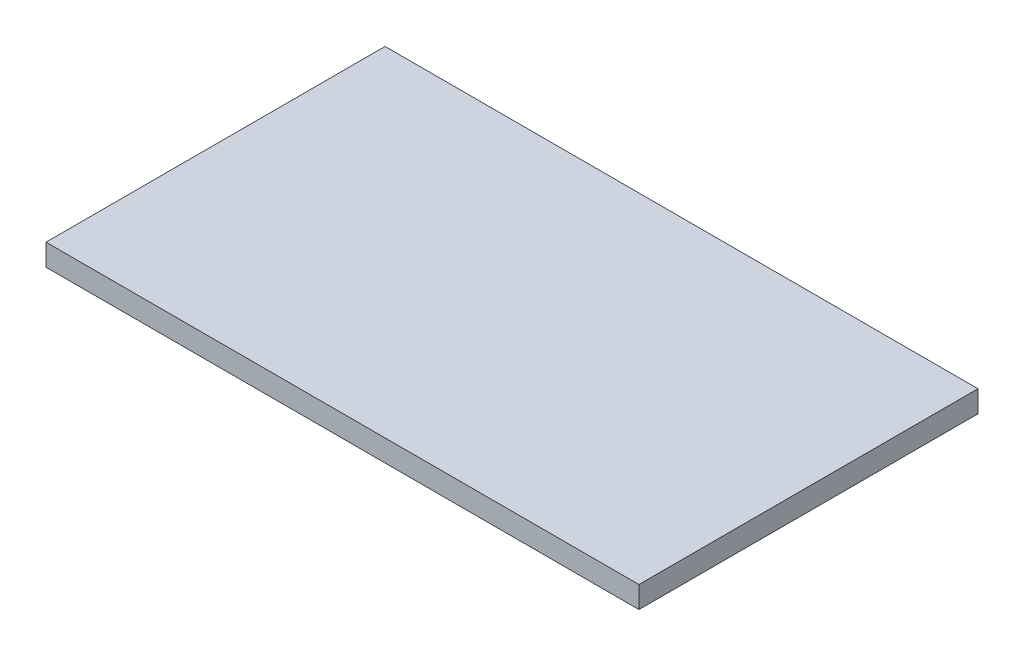
ISO-10303-21;
HEADER;
FILE_DESCRIPTION(('STEP AP214'),'2;1');
FILE_NAME('part.step','',(''),(''),'','','');
FILE_SCHEMA(('AUTOMOTIVE_DESIGN { 1 0 10303 214 1 1 1 1 }'));
ENDSEC;
DATA;
#1=APPLICATION_CONTEXT('core data for automotive mechanical design processes');
#2=APPLICATION_PROTOCOL_DEFINITION('international standard','automotive_design',2000,#1);
#3=PRODUCT_CONTEXT('',#1,'mechanical');
#4=PRODUCT('Part','Part','',(#3));
#5=PRODUCT_RELATED_PRODUCT_CATEGORY('part','',(#4));
#6=PRODUCT_DEFINITION_FORMATION('','',#4);
#7=PRODUCT_DEFINITION_CONTEXT('part definition',#1,'design');
#8=PRODUCT_DEFINITION('design','',#6,#7);
#9=PRODUCT_DEFINITION_SHAPE('','',#8);
#10=(LENGTH_UNIT() NAMED_UNIT(*) SI_UNIT(.MILLI.,.METRE.));
#11=(NAMED_UNIT(*) PLANE_ANGLE_UNIT() SI_UNIT($,.RADIAN.));
#12=(NAMED_UNIT(*) SI_UNIT($,.STERADIAN.) SOLID_ANGLE_UNIT());
#13=UNCERTAINTY_MEASURE_WITH_UNIT(LENGTH_MEASURE(1.E-05),#10,'distance_accuracy_value','');
#14=(GEOMETRIC_REPRESENTATION_CONTEXT(3) GLOBAL_UNCERTAINTY_ASSIGNED_CONTEXT((#13)) GLOBAL_UNIT_ASSIGNED_CONTEXT((#10,
#11,#12)) REPRESENTATION_CONTEXT('',''));
#15=CARTESIAN_POINT('',(0.,0.,0.));
#16=DIRECTION('',(0.,0.,1.));
#17=DIRECTION('',(1.,0.,0.));
#18=AXIS2_PLACEMENT_3D('',#15,#16,#17);
#19=CARTESIAN_POINT('',(-45.9994910941476,2.6,-12.4486005089058));
#20=DIRECTION('',(1.,0.,0.));
#21=DIRECTION('',(0.,0.,-1.));
#22=AXIS2_PLACEMENT_3D('',#19,#20,#21);
#23=PLANE('',#22);
#24=DIRECTION('',(0.,0.,1.));
#25=VECTOR('',#24,1.);
#26=CARTESIAN_POINT('',(-45.9994910941476,0.,-12.4486005089058));
#27=LINE('',#26,#25);
#28=CARTESIAN_POINT('',(-45.9994910941476,0.,-12.4486005089058));
#29=VERTEX_POINT('',#28);
#30=CARTESIAN_POINT('',(-45.9994910941476,0.,28.1513994910942));
#31=VERTEX_POINT('',#30);
#32=EDGE_CURVE('E98',#29,#31,#27,.T.);
#33=ORIENTED_EDGE('',*,*,#32,.T.);
#34=DIRECTION('',(0.,-1.,0.));
#35=VECTOR('',#34,1.);
#36=CARTESIAN_POINT('',(-45.9994910941476,2.6,28.1513994910942));
#37=LINE('',#36,#35);
#38=CARTESIAN_POINT('',(-45.9994910941476,2.6,28.1513994910942));
#39=VERTEX_POINT('',#38);
#40=EDGE_CURVE('E11',#39,#31,#37,.T.);
#41=ORIENTED_EDGE('',*,*,#40,.F.);
#42=DIRECTION('',(0.,0.,1.));
#43=VECTOR('',#42,1.);
#44=CARTESIAN_POINT('',(-45.9994910941476,2.6,-12.4486005089058));
#45=LINE('',#44,#43);
#46=CARTESIAN_POINT('',(-45.9994910941476,2.6,-12.4486005089058));
#47=VERTEX_POINT('',#46);
#48=EDGE_CURVE('E86',#47,#39,#45,.T.);
#49=ORIENTED_EDGE('',*,*,#48,.F.);
#50=DIRECTION('',(0.,-1.,0.));
#51=VECTOR('',#50,1.);
#52=CARTESIAN_POINT('',(-45.9994910941476,2.6,-12.4486005089058));
#53=LINE('',#52,#51);
#54=EDGE_CURVE('E94',#47,#29,#53,.T.);
#55=ORIENTED_EDGE('',*,*,#54,.T.);
#56=EDGE_LOOP('',(#33,#41,#49,#55));
#57=FACE_BOUND('',#56,.T.);
#58=ADVANCED_FACE('F35',(#57),#23,.F.);
#59=CARTESIAN_POINT('',(-45.9994910941476,2.6,28.1513994910942));
#60=DIRECTION('',(0.,0.,-1.));
#61=DIRECTION('',(-1.,0.,0.));
#62=AXIS2_PLACEMENT_3D('',#59,#60,#61);
#63=PLANE('',#62);
#64=DIRECTION('',(1.,0.,0.));
#65=VECTOR('',#64,1.);
#66=CARTESIAN_POINT('',(-45.9994910941476,0.,28.1513994910942));
#67=LINE('',#66,#65);
#68=CARTESIAN_POINT('',(25.0005089058524,0.,28.1513994910942));
#69=VERTEX_POINT('',#68);
#70=EDGE_CURVE('E90',#31,#69,#67,.T.);
#71=ORIENTED_EDGE('',*,*,#70,.T.);
#72=DIRECTION('',(0.,-1.,0.));
#73=VECTOR('',#72,1.);
#74=CARTESIAN_POINT('',(25.0005089058524,2.6,28.1513994910942));
#75=LINE('',#74,#73);
#76=CARTESIAN_POINT('',(25.0005089058524,2.6,28.1513994910942));
#77=VERTEX_POINT('',#76);
#78=EDGE_CURVE('E43',#77,#69,#75,.T.);
#79=ORIENTED_EDGE('',*,*,#78,.F.);
#80=DIRECTION('',(1.,0.,0.));
#81=VECTOR('',#80,1.);
#82=CARTESIAN_POINT('',(-45.9994910941476,2.6,28.1513994910942));
#83=LINE('',#82,#81);
#84=EDGE_CURVE('E81',#39,#77,#83,.T.);
#85=ORIENTED_EDGE('',*,*,#84,.F.);
#86=ORIENTED_EDGE('',*,*,#40,.T.);
#87=EDGE_LOOP('',(#71,#79,#85,#86));
#88=FACE_BOUND('',#87,.T.);
#89=ADVANCED_FACE('F89',(#88),#63,.F.);
#90=CARTESIAN_POINT('',(25.0005089058524,2.6,-12.4486005089058));
#91=DIRECTION('',(-1.,0.,0.));
#92=DIRECTION('',(0.,0.,1.));
#93=AXIS2_PLACEMENT_3D('',#90,#91,#92);
#94=PLANE('',#93);
#95=DIRECTION('',(0.,0.,-1.));
#96=VECTOR('',#95,1.);
#97=CARTESIAN_POINT('',(25.0005089058524,0.,-12.4486005089058));
#98=LINE('',#97,#96);
#99=CARTESIAN_POINT('',(25.0005089058524,0.,-12.4486005089058));
#100=VERTEX_POINT('',#99);
#101=EDGE_CURVE('E68',#69,#100,#98,.T.);
#102=ORIENTED_EDGE('',*,*,#101,.T.);
#103=DIRECTION('',(0.,-1.,0.));
#104=VECTOR('',#103,1.);
#105=CARTESIAN_POINT('',(25.0005089058524,2.6,-12.4486005089058));
#106=LINE('',#105,#104);
#107=CARTESIAN_POINT('',(25.0005089058524,2.6,-12.4486005089058));
#108=VERTEX_POINT('',#107);
#109=EDGE_CURVE('E91',#108,#100,#106,.T.);
#110=ORIENTED_EDGE('',*,*,#109,.F.);
#111=DIRECTION('',(0.,0.,-1.));
#112=VECTOR('',#111,1.);
#113=CARTESIAN_POINT('',(25.0005089058524,2.6,-12.4486005089058));
#114=LINE('',#113,#112);
#115=EDGE_CURVE('E84',#77,#108,#114,.T.);
#116=ORIENTED_EDGE('',*,*,#115,.F.);
#117=ORIENTED_EDGE('',*,*,#78,.T.);
#118=EDGE_LOOP('',(#102,#110,#116,#117));
#119=FACE_BOUND('',#118,.T.);
#120=ADVANCED_FACE('F92',(#119),#94,.F.);
#121=CARTESIAN_POINT('',(-45.9994910941476,2.6,-12.4486005089058));
#122=DIRECTION('',(0.,0.,1.));
#123=DIRECTION('',(1.,0.,0.));
#124=AXIS2_PLACEMENT_3D('',#121,#122,#123);
#125=PLANE('',#124);
#126=DIRECTION('',(-1.,0.,0.));
#127=VECTOR('',#126,1.);
#128=CARTESIAN_POINT('',(-45.9994910941476,0.,-12.4486005089058));
#129=LINE('',#128,#127);
#130=EDGE_CURVE('E74',#100,#29,#129,.T.);
#131=ORIENTED_EDGE('',*,*,#130,.T.);
#132=ORIENTED_EDGE('',*,*,#54,.F.);
#133=DIRECTION('',(-1.,0.,0.));
#134=VECTOR('',#133,1.);
#135=CARTESIAN_POINT('',(-45.9994910941476,2.6,-12.4486005089058));
#136=LINE('',#135,#134);
#137=EDGE_CURVE('E51',#108,#47,#136,.T.);
#138=ORIENTED_EDGE('',*,*,#137,.F.);
#139=ORIENTED_EDGE('',*,*,#109,.T.);
#140=EDGE_LOOP('',(#131,#132,#138,#139));
#141=FACE_BOUND('',#140,.T.);
#142=ADVANCED_FACE('F105',(#141),#125,.F.);
#143=CARTESIAN_POINT('',(0.,2.6,0.));
#144=DIRECTION('',(0.,1.,0.));
#145=DIRECTION('',(0.,0.,1.));
#146=AXIS2_PLACEMENT_3D('',#143,#144,#145);
#147=PLANE('',#146);
#148=ORIENTED_EDGE('',*,*,#48,.T.);
#149=ORIENTED_EDGE('',*,*,#84,.T.);
#150=ORIENTED_EDGE('',*,*,#115,.T.);
#151=ORIENTED_EDGE('',*,*,#137,.T.);
#152=EDGE_LOOP('',(#148,#149,#150,#151));
#153=FACE_BOUND('',#152,.T.);
#154=ADVANCED_FACE('F82',(#153),#147,.T.);
#155=CARTESIAN_POINT('',(0.,0.,0.));
#156=DIRECTION('',(0.,1.,0.));
#157=DIRECTION('',(0.,0.,1.));
#158=AXIS2_PLACEMENT_3D('',#155,#156,#157);
#159=PLANE('',#158);
#160=ORIENTED_EDGE('',*,*,#32,.F.);
#161=ORIENTED_EDGE('',*,*,#130,.F.);
#162=ORIENTED_EDGE('',*,*,#101,.F.);
#163=ORIENTED_EDGE('',*,*,#70,.F.);
#164=EDGE_LOOP('',(#160,#161,#162,#163));
#165=FACE_BOUND('',#164,.T.);
#166=ADVANCED_FACE('F108',(#165),#159,.F.);
#167=CLOSED_SHELL('',(#58,#89,#120,#142,#154,#166));
#168=MANIFOLD_SOLID_BREP('B2',#167);
#169=ADVANCED_BREP_SHAPE_REPRESENTATION('',(#18,#168),#14);
#170=SHAPE_DEFINITION_REPRESENTATION(#9,#169);
ENDSEC;
END-ISO-10303-21;
